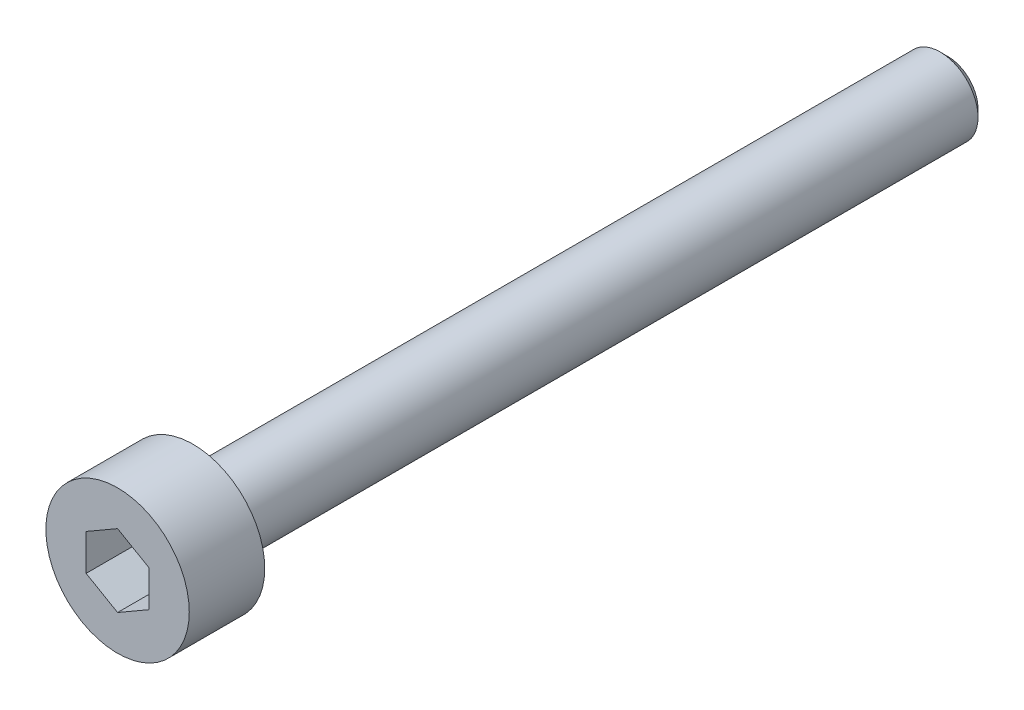
ISO-10303-21;
HEADER;
FILE_DESCRIPTION(('STEP AP214'),'2;1');
FILE_NAME('part.step','',(''),(''),'','','');
FILE_SCHEMA(('AUTOMOTIVE_DESIGN { 1 0 10303 214 1 1 1 1 }'));
ENDSEC;
DATA;
#1=APPLICATION_CONTEXT('core data for automotive mechanical design processes');
#2=APPLICATION_PROTOCOL_DEFINITION('international standard','automotive_design',2000,#1);
#3=PRODUCT_CONTEXT('',#1,'mechanical');
#4=PRODUCT('Part','Part','',(#3));
#5=PRODUCT_RELATED_PRODUCT_CATEGORY('part','',(#4));
#6=PRODUCT_DEFINITION_FORMATION('','',#4);
#7=PRODUCT_DEFINITION_CONTEXT('part definition',#1,'design');
#8=PRODUCT_DEFINITION('design','',#6,#7);
#9=PRODUCT_DEFINITION_SHAPE('','',#8);
#10=(LENGTH_UNIT() NAMED_UNIT(*) SI_UNIT(.MILLI.,.METRE.));
#11=(NAMED_UNIT(*) PLANE_ANGLE_UNIT() SI_UNIT($,.RADIAN.));
#12=(NAMED_UNIT(*) SI_UNIT($,.STERADIAN.) SOLID_ANGLE_UNIT());
#13=UNCERTAINTY_MEASURE_WITH_UNIT(LENGTH_MEASURE(1.E-05),#10,'distance_accuracy_value','');
#14=(GEOMETRIC_REPRESENTATION_CONTEXT(3) GLOBAL_UNCERTAINTY_ASSIGNED_CONTEXT((#13)) GLOBAL_UNIT_ASSIGNED_CONTEXT((#10,
#11,#12)) REPRESENTATION_CONTEXT('',''));
#15=CARTESIAN_POINT('',(0.,0.,0.));
#16=DIRECTION('',(0.,0.,1.));
#17=DIRECTION('',(1.,0.,0.));
#18=AXIS2_PLACEMENT_3D('',#15,#16,#17);
#19=CARTESIAN_POINT('',(0.,0.,0.));
#20=DIRECTION('',(0.,0.,1.));
#21=DIRECTION('',(1.,0.,0.));
#22=AXIS2_PLACEMENT_3D('',#19,#20,#21);
#23=PLANE('',#22);
#24=CARTESIAN_POINT('',(0.,0.,0.));
#25=DIRECTION('',(0.,0.,1.));
#26=DIRECTION('',(1.,0.,0.));
#27=AXIS2_PLACEMENT_3D('',#24,#25,#26);
#28=CIRCLE('',#27,2.85);
#29=CARTESIAN_POINT('',(2.85,0.,0.));
#30=VERTEX_POINT('',#29);
#31=EDGE_CURVE('E138',#30,#30,#28,.T.);
#32=ORIENTED_EDGE('',*,*,#31,.F.);
#33=EDGE_LOOP('',(#32));
#34=FACE_BOUND('',#33,.T.);
#35=CARTESIAN_POINT('',(0.,0.,0.));
#36=DIRECTION('',(0.,0.,1.));
#37=DIRECTION('',(1.,0.,0.));
#38=AXIS2_PLACEMENT_3D('',#35,#36,#37);
#39=CIRCLE('',#38,1.5);
#40=CARTESIAN_POINT('',(1.5,0.,0.));
#41=VERTEX_POINT('',#40);
#42=EDGE_CURVE('E147',#41,#41,#39,.F.);
#43=ORIENTED_EDGE('',*,*,#42,.F.);
#44=EDGE_LOOP('',(#43));
#45=FACE_BOUND('',#44,.T.);
#46=ADVANCED_FACE('F36',(#34,#45),#23,.F.);
#47=CARTESIAN_POINT('',(0.,0.,3.));
#48=DIRECTION('',(0.,0.,-1.));
#49=DIRECTION('',(-1.,0.,0.));
#50=AXIS2_PLACEMENT_3D('',#47,#48,#49);
#51=CYLINDRICAL_SURFACE('',#50,2.85);
#52=CARTESIAN_POINT('',(0.,0.,3.));
#53=DIRECTION('',(0.,0.,1.));
#54=DIRECTION('',(1.,0.,0.));
#55=AXIS2_PLACEMENT_3D('',#52,#53,#54);
#56=CIRCLE('',#55,2.85);
#57=CARTESIAN_POINT('',(2.85,0.,3.));
#58=VERTEX_POINT('',#57);
#59=EDGE_CURVE('E144',#58,#58,#56,.T.);
#60=ORIENTED_EDGE('',*,*,#59,.F.);
#61=EDGE_LOOP('',(#60));
#62=FACE_BOUND('',#61,.T.);
#63=ORIENTED_EDGE('',*,*,#31,.T.);
#64=EDGE_LOOP('',(#63));
#65=FACE_BOUND('',#64,.T.);
#66=ADVANCED_FACE('F169',(#62,#65),#51,.T.);
#67=CARTESIAN_POINT('',(0.,0.,3.));
#68=DIRECTION('',(0.,0.,1.));
#69=DIRECTION('',(1.,0.,0.));
#70=AXIS2_PLACEMENT_3D('',#67,#68,#69);
#71=PLANE('',#70);
#72=DIRECTION('',(-0.866025403784439,0.5,0.));
#73=VECTOR('',#72,1.);
#74=CARTESIAN_POINT('',(1.25,0.721687836487032,3.));
#75=LINE('',#74,#73);
#76=CARTESIAN_POINT('',(1.25,0.721687836487032,3.));
#77=VERTEX_POINT('',#76);
#78=CARTESIAN_POINT('',(0.,1.44337567297406,3.));
#79=VERTEX_POINT('',#78);
#80=EDGE_CURVE('E51',#77,#79,#75,.T.);
#81=ORIENTED_EDGE('',*,*,#80,.F.);
#82=DIRECTION('',(0.,1.,0.));
#83=VECTOR('',#82,1.);
#84=CARTESIAN_POINT('',(1.25,-0.721687836487032,3.));
#85=LINE('',#84,#83);
#86=CARTESIAN_POINT('',(1.25,-0.721687836487032,3.));
#87=VERTEX_POINT('',#86);
#88=EDGE_CURVE('E134',#87,#77,#85,.T.);
#89=ORIENTED_EDGE('',*,*,#88,.F.);
#90=DIRECTION('',(0.866025403784439,0.5,0.));
#91=VECTOR('',#90,1.);
#92=CARTESIAN_POINT('',(0.,-1.44337567297406,3.));
#93=LINE('',#92,#91);
#94=CARTESIAN_POINT('',(0.,-1.44337567297406,3.));
#95=VERTEX_POINT('',#94);
#96=EDGE_CURVE('E132',#95,#87,#93,.T.);
#97=ORIENTED_EDGE('',*,*,#96,.F.);
#98=DIRECTION('',(0.866025403784439,-0.5,0.));
#99=VECTOR('',#98,1.);
#100=CARTESIAN_POINT('',(-1.25,-0.721687836487033,3.));
#101=LINE('',#100,#99);
#102=CARTESIAN_POINT('',(-1.25,-0.721687836487033,3.));
#103=VERTEX_POINT('',#102);
#104=EDGE_CURVE('E99',#103,#95,#101,.T.);
#105=ORIENTED_EDGE('',*,*,#104,.F.);
#106=DIRECTION('',(0.,-1.,0.));
#107=VECTOR('',#106,1.);
#108=CARTESIAN_POINT('',(-1.25,0.721687836487032,3.));
#109=LINE('',#108,#107);
#110=CARTESIAN_POINT('',(-1.25,0.721687836487032,3.));
#111=VERTEX_POINT('',#110);
#112=EDGE_CURVE('E128',#111,#103,#109,.T.);
#113=ORIENTED_EDGE('',*,*,#112,.F.);
#114=DIRECTION('',(-0.866025403784439,-0.5,0.));
#115=VECTOR('',#114,1.);
#116=CARTESIAN_POINT('',(0.,1.44337567297406,3.));
#117=LINE('',#116,#115);
#118=EDGE_CURVE('E125',#79,#111,#117,.T.);
#119=ORIENTED_EDGE('',*,*,#118,.F.);
#120=EDGE_LOOP('',(#81,#89,#97,#105,#113,#119));
#121=FACE_BOUND('',#120,.T.);
#122=ORIENTED_EDGE('',*,*,#59,.T.);
#123=EDGE_LOOP('',(#122));
#124=FACE_BOUND('',#123,.T.);
#125=ADVANCED_FACE('F175',(#121,#124),#71,.T.);
#126=CARTESIAN_POINT('',(0.,0.,-30.));
#127=DIRECTION('',(0.,0.,1.));
#128=DIRECTION('',(1.,0.,0.));
#129=AXIS2_PLACEMENT_3D('',#126,#127,#128);
#130=CYLINDRICAL_SURFACE('',#129,1.5);
#131=CARTESIAN_POINT('',(0.,0.,-29.7));
#132=DIRECTION('',(0.,0.,-1.));
#133=DIRECTION('',(-1.,0.,0.));
#134=AXIS2_PLACEMENT_3D('',#131,#132,#133);
#135=CIRCLE('',#134,1.5);
#136=CARTESIAN_POINT('',(-1.5,0.,-29.7));
#137=VERTEX_POINT('',#136);
#138=EDGE_CURVE('E11',#137,#137,#135,.F.);
#139=ORIENTED_EDGE('',*,*,#138,.T.);
#140=EDGE_LOOP('',(#139));
#141=FACE_BOUND('',#140,.T.);
#142=ORIENTED_EDGE('',*,*,#42,.T.);
#143=EDGE_LOOP('',(#142));
#144=FACE_BOUND('',#143,.T.);
#145=ADVANCED_FACE('F165',(#141,#144),#130,.T.);
#146=CARTESIAN_POINT('',(0.,0.,-30.));
#147=DIRECTION('',(0.,0.,-1.));
#148=DIRECTION('',(-1.,0.,0.));
#149=AXIS2_PLACEMENT_3D('',#146,#147,#148);
#150=PLANE('',#149);
#151=CARTESIAN_POINT('',(0.,0.,-30.));
#152=DIRECTION('',(0.,0.,-1.));
#153=DIRECTION('',(-1.,0.,0.));
#154=AXIS2_PLACEMENT_3D('',#151,#152,#153);
#155=CIRCLE('',#154,1.19999999999999);
#156=CARTESIAN_POINT('',(-1.19999999999999,0.,-30.));
#157=VERTEX_POINT('',#156);
#158=EDGE_CURVE('E44',#157,#157,#155,.T.);
#159=ORIENTED_EDGE('',*,*,#158,.T.);
#160=EDGE_LOOP('',(#159));
#161=FACE_BOUND('',#160,.T.);
#162=ADVANCED_FACE('F154',(#161),#150,.T.);
#163=CARTESIAN_POINT('',(0.,0.,-30.));
#164=DIRECTION('',(0.,0.,1.));
#165=DIRECTION('',(1.,0.,0.));
#166=AXIS2_PLACEMENT_3D('',#163,#164,#165);
#167=CONICAL_SURFACE('',#166,1.19999999999999,0.785398163397447);
#168=ORIENTED_EDGE('',*,*,#138,.F.);
#169=EDGE_LOOP('',(#168));
#170=FACE_BOUND('',#169,.T.);
#171=ORIENTED_EDGE('',*,*,#158,.F.);
#172=EDGE_LOOP('',(#171));
#173=FACE_BOUND('',#172,.T.);
#174=ADVANCED_FACE('F38',(#170,#173),#167,.T.);
#175=CARTESIAN_POINT('',(1.25,0.721687836487032,1.));
#176=DIRECTION('',(0.5,0.866025403784439,0.));
#177=DIRECTION('',(-0.866025403784439,0.5,0.));
#178=AXIS2_PLACEMENT_3D('',#175,#176,#177);
#179=PLANE('',#178);
#180=ORIENTED_EDGE('',*,*,#80,.T.);
#181=DIRECTION('',(0.,0.,1.));
#182=VECTOR('',#181,1.);
#183=CARTESIAN_POINT('',(0.,1.44337567297406,1.));
#184=LINE('',#183,#182);
#185=CARTESIAN_POINT('',(0.,1.44337567297406,1.));
#186=VERTEX_POINT('',#185);
#187=EDGE_CURVE('E81',#186,#79,#184,.T.);
#188=ORIENTED_EDGE('',*,*,#187,.F.);
#189=DIRECTION('',(-0.866025403784439,0.5,0.));
#190=VECTOR('',#189,1.);
#191=CARTESIAN_POINT('',(1.25,0.721687836487032,1.));
#192=LINE('',#191,#190);
#193=CARTESIAN_POINT('',(1.25,0.721687836487032,1.));
#194=VERTEX_POINT('',#193);
#195=EDGE_CURVE('E136',#194,#186,#192,.T.);
#196=ORIENTED_EDGE('',*,*,#195,.F.);
#197=DIRECTION('',(0.,0.,1.));
#198=VECTOR('',#197,1.);
#199=CARTESIAN_POINT('',(1.25,0.721687836487032,1.));
#200=LINE('',#199,#198);
#201=EDGE_CURVE('E59',#194,#77,#200,.T.);
#202=ORIENTED_EDGE('',*,*,#201,.T.);
#203=EDGE_LOOP('',(#180,#188,#196,#202));
#204=FACE_BOUND('',#203,.T.);
#205=ADVANCED_FACE('F157',(#204),#179,.F.);
#206=CARTESIAN_POINT('',(1.25,-0.721687836487032,1.));
#207=DIRECTION('',(1.,0.,0.));
#208=DIRECTION('',(0.,1.,0.));
#209=AXIS2_PLACEMENT_3D('',#206,#207,#208);
#210=PLANE('',#209);
#211=ORIENTED_EDGE('',*,*,#88,.T.);
#212=ORIENTED_EDGE('',*,*,#201,.F.);
#213=DIRECTION('',(0.,1.,0.));
#214=VECTOR('',#213,1.);
#215=CARTESIAN_POINT('',(1.25,-0.721687836487032,1.));
#216=LINE('',#215,#214);
#217=CARTESIAN_POINT('',(1.25,-0.721687836487032,1.));
#218=VERTEX_POINT('',#217);
#219=EDGE_CURVE('E111',#218,#194,#216,.T.);
#220=ORIENTED_EDGE('',*,*,#219,.F.);
#221=DIRECTION('',(0.,0.,1.));
#222=VECTOR('',#221,1.);
#223=CARTESIAN_POINT('',(1.25,-0.721687836487032,1.));
#224=LINE('',#223,#222);
#225=EDGE_CURVE('E103',#218,#87,#224,.T.);
#226=ORIENTED_EDGE('',*,*,#225,.T.);
#227=EDGE_LOOP('',(#211,#212,#220,#226));
#228=FACE_BOUND('',#227,.T.);
#229=ADVANCED_FACE('F163',(#228),#210,.F.);
#230=CARTESIAN_POINT('',(0.,-1.44337567297406,1.));
#231=DIRECTION('',(0.5,-0.866025403784439,0.));
#232=DIRECTION('',(0.866025403784439,0.5,0.));
#233=AXIS2_PLACEMENT_3D('',#230,#231,#232);
#234=PLANE('',#233);
#235=ORIENTED_EDGE('',*,*,#96,.T.);
#236=ORIENTED_EDGE('',*,*,#225,.F.);
#237=DIRECTION('',(0.866025403784439,0.5,0.));
#238=VECTOR('',#237,1.);
#239=CARTESIAN_POINT('',(0.,-1.44337567297406,1.));
#240=LINE('',#239,#238);
#241=CARTESIAN_POINT('',(0.,-1.44337567297406,1.));
#242=VERTEX_POINT('',#241);
#243=EDGE_CURVE('E107',#242,#218,#240,.T.);
#244=ORIENTED_EDGE('',*,*,#243,.F.);
#245=DIRECTION('',(0.,0.,1.));
#246=VECTOR('',#245,1.);
#247=CARTESIAN_POINT('',(0.,-1.44337567297406,1.));
#248=LINE('',#247,#246);
#249=EDGE_CURVE('E92',#242,#95,#248,.T.);
#250=ORIENTED_EDGE('',*,*,#249,.T.);
#251=EDGE_LOOP('',(#235,#236,#244,#250));
#252=FACE_BOUND('',#251,.T.);
#253=ADVANCED_FACE('F108',(#252),#234,.F.);
#254=CARTESIAN_POINT('',(-1.25,-0.721687836487033,1.));
#255=DIRECTION('',(-0.5,-0.866025403784439,0.));
#256=DIRECTION('',(0.866025403784439,-0.5,0.));
#257=AXIS2_PLACEMENT_3D('',#254,#255,#256);
#258=PLANE('',#257);
#259=ORIENTED_EDGE('',*,*,#104,.T.);
#260=ORIENTED_EDGE('',*,*,#249,.F.);
#261=DIRECTION('',(0.866025403784439,-0.5,0.));
#262=VECTOR('',#261,1.);
#263=CARTESIAN_POINT('',(-1.25,-0.721687836487033,1.));
#264=LINE('',#263,#262);
#265=CARTESIAN_POINT('',(-1.25,-0.721687836487033,1.));
#266=VERTEX_POINT('',#265);
#267=EDGE_CURVE('E96',#266,#242,#264,.T.);
#268=ORIENTED_EDGE('',*,*,#267,.F.);
#269=DIRECTION('',(0.,0.,1.));
#270=VECTOR('',#269,1.);
#271=CARTESIAN_POINT('',(-1.25,-0.721687836487033,1.));
#272=LINE('',#271,#270);
#273=EDGE_CURVE('E104',#266,#103,#272,.T.);
#274=ORIENTED_EDGE('',*,*,#273,.T.);
#275=EDGE_LOOP('',(#259,#260,#268,#274));
#276=FACE_BOUND('',#275,.T.);
#277=ADVANCED_FACE('F94',(#276),#258,.F.);
#278=CARTESIAN_POINT('',(-1.25,0.721687836487032,1.));
#279=DIRECTION('',(-1.,0.,0.));
#280=DIRECTION('',(0.,0.,1.));
#281=AXIS2_PLACEMENT_3D('',#278,#279,#280);
#282=PLANE('',#281);
#283=ORIENTED_EDGE('',*,*,#112,.T.);
#284=ORIENTED_EDGE('',*,*,#273,.F.);
#285=DIRECTION('',(0.,-1.,0.));
#286=VECTOR('',#285,1.);
#287=CARTESIAN_POINT('',(-1.25,0.721687836487032,1.));
#288=LINE('',#287,#286);
#289=CARTESIAN_POINT('',(-1.25,0.721687836487032,1.));
#290=VERTEX_POINT('',#289);
#291=EDGE_CURVE('E117',#290,#266,#288,.T.);
#292=ORIENTED_EDGE('',*,*,#291,.F.);
#293=DIRECTION('',(0.,0.,1.));
#294=VECTOR('',#293,1.);
#295=CARTESIAN_POINT('',(-1.25,0.721687836487032,1.));
#296=LINE('',#295,#294);
#297=EDGE_CURVE('E141',#290,#111,#296,.T.);
#298=ORIENTED_EDGE('',*,*,#297,.T.);
#299=EDGE_LOOP('',(#283,#284,#292,#298));
#300=FACE_BOUND('',#299,.T.);
#301=ADVANCED_FACE('F189',(#300),#282,.F.);
#302=CARTESIAN_POINT('',(0.,1.44337567297406,1.));
#303=DIRECTION('',(-0.5,0.866025403784439,0.));
#304=DIRECTION('',(-0.866025403784439,-0.5,0.));
#305=AXIS2_PLACEMENT_3D('',#302,#303,#304);
#306=PLANE('',#305);
#307=ORIENTED_EDGE('',*,*,#118,.T.);
#308=ORIENTED_EDGE('',*,*,#297,.F.);
#309=DIRECTION('',(-0.866025403784439,-0.5,0.));
#310=VECTOR('',#309,1.);
#311=CARTESIAN_POINT('',(0.,1.44337567297406,1.));
#312=LINE('',#311,#310);
#313=EDGE_CURVE('E119',#186,#290,#312,.T.);
#314=ORIENTED_EDGE('',*,*,#313,.F.);
#315=ORIENTED_EDGE('',*,*,#187,.T.);
#316=EDGE_LOOP('',(#307,#308,#314,#315));
#317=FACE_BOUND('',#316,.T.);
#318=ADVANCED_FACE('F186',(#317),#306,.F.);
#319=CARTESIAN_POINT('',(0.,0.,1.));
#320=DIRECTION('',(0.,0.,1.));
#321=DIRECTION('',(1.,0.,0.));
#322=AXIS2_PLACEMENT_3D('',#319,#320,#321);
#323=PLANE('',#322);
#324=ORIENTED_EDGE('',*,*,#195,.T.);
#325=ORIENTED_EDGE('',*,*,#313,.T.);
#326=ORIENTED_EDGE('',*,*,#291,.T.);
#327=ORIENTED_EDGE('',*,*,#267,.T.);
#328=ORIENTED_EDGE('',*,*,#243,.T.);
#329=ORIENTED_EDGE('',*,*,#219,.T.);
#330=EDGE_LOOP('',(#324,#325,#326,#327,#328,#329));
#331=FACE_BOUND('',#330,.T.);
#332=ADVANCED_FACE('F114',(#331),#323,.T.);
#333=CLOSED_SHELL('',(#46,#66,#125,#145,#162,#174,#205,#229,#253,#277,#301,#318,#332));
#334=MANIFOLD_SOLID_BREP('B2',#333);
#335=ADVANCED_BREP_SHAPE_REPRESENTATION('',(#18,#334),#14);
#336=SHAPE_DEFINITION_REPRESENTATION(#9,#335);
ENDSEC;
END-ISO-10303-21;
